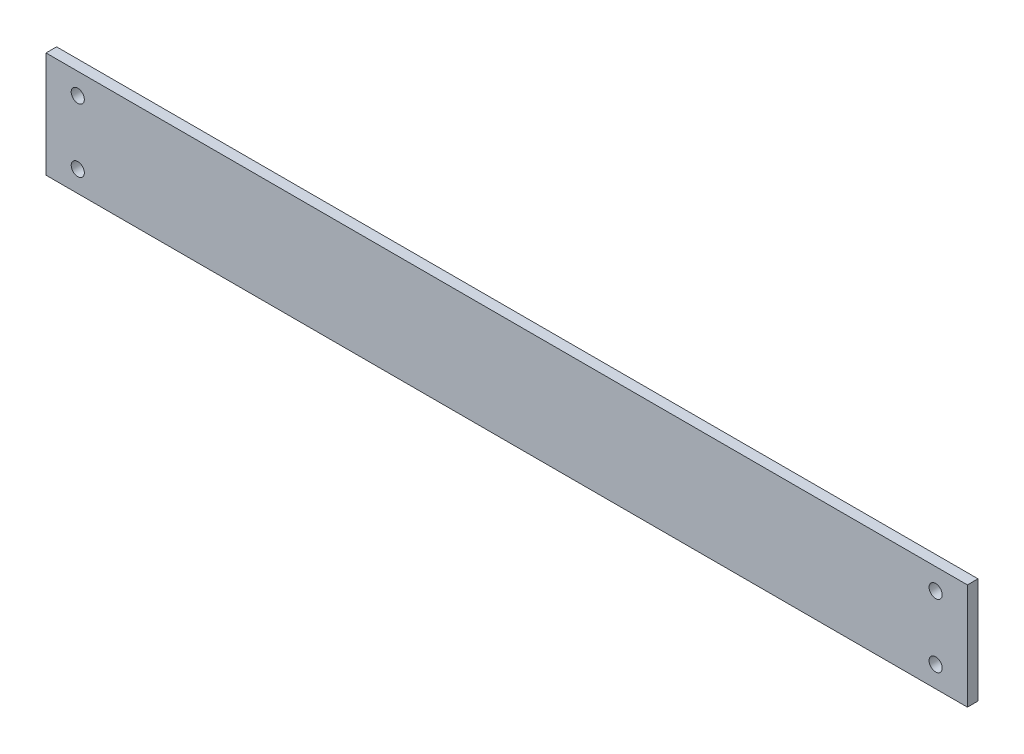
ISO-10303-21;
HEADER;
FILE_DESCRIPTION(('STEP AP214'),'2;1');
FILE_NAME('part.step','',(''),(''),'','','');
FILE_SCHEMA(('AUTOMOTIVE_DESIGN { 1 0 10303 214 1 1 1 1 }'));
ENDSEC;
DATA;
#1=APPLICATION_CONTEXT('core data for automotive mechanical design processes');
#2=APPLICATION_PROTOCOL_DEFINITION('international standard','automotive_design',2000,#1);
#3=PRODUCT_CONTEXT('',#1,'mechanical');
#4=PRODUCT('Part','Part','',(#3));
#5=PRODUCT_RELATED_PRODUCT_CATEGORY('part','',(#4));
#6=PRODUCT_DEFINITION_FORMATION('','',#4);
#7=PRODUCT_DEFINITION_CONTEXT('part definition',#1,'design');
#8=PRODUCT_DEFINITION('design','',#6,#7);
#9=PRODUCT_DEFINITION_SHAPE('','',#8);
#10=(LENGTH_UNIT() NAMED_UNIT(*) SI_UNIT(.MILLI.,.METRE.));
#11=(NAMED_UNIT(*) PLANE_ANGLE_UNIT() SI_UNIT($,.RADIAN.));
#12=(NAMED_UNIT(*) SI_UNIT($,.STERADIAN.) SOLID_ANGLE_UNIT());
#13=UNCERTAINTY_MEASURE_WITH_UNIT(LENGTH_MEASURE(1.E-05),#10,'distance_accuracy_value','');
#14=(GEOMETRIC_REPRESENTATION_CONTEXT(3) GLOBAL_UNCERTAINTY_ASSIGNED_CONTEXT((#13)) GLOBAL_UNIT_ASSIGNED_CONTEXT((#10,
#11,#12)) REPRESENTATION_CONTEXT('',''));
#15=CARTESIAN_POINT('',(0.,0.,0.));
#16=DIRECTION('',(0.,0.,1.));
#17=DIRECTION('',(1.,0.,0.));
#18=AXIS2_PLACEMENT_3D('',#15,#16,#17);
#19=CARTESIAN_POINT('',(257.175,19.0499999999999,-556.123704763608));
#20=DIRECTION('',(0.,0.,1.));
#21=DIRECTION('',(1.,0.,0.));
#22=AXIS2_PLACEMENT_3D('',#19,#20,#21);
#23=CYLINDRICAL_SURFACE('',#22,3.937);
#24=CARTESIAN_POINT('',(257.175,19.0499999999999,-6.34999999999998));
#25=DIRECTION('',(0.,0.,1.));
#26=DIRECTION('',(1.,0.,0.));
#27=AXIS2_PLACEMENT_3D('',#24,#25,#26);
#28=CIRCLE('',#27,3.937);
#29=CARTESIAN_POINT('',(261.112,19.0499999999999,-6.34999999999998));
#30=VERTEX_POINT('',#29);
#31=EDGE_CURVE('E81',#30,#30,#28,.T.);
#32=ORIENTED_EDGE('',*,*,#31,.F.);
#33=EDGE_LOOP('',(#32));
#34=FACE_BOUND('',#33,.T.);
#35=CARTESIAN_POINT('',(257.175,19.0499999999999,0.));
#36=DIRECTION('',(0.,0.,-1.));
#37=DIRECTION('',(0.,-1.,0.));
#38=AXIS2_PLACEMENT_3D('',#35,#36,#37);
#39=CIRCLE('',#38,3.937);
#40=CARTESIAN_POINT('',(257.175,15.1129999999999,0.));
#41=VERTEX_POINT('',#40);
#42=EDGE_CURVE('E94',#41,#41,#39,.T.);
#43=ORIENTED_EDGE('',*,*,#42,.F.);
#44=EDGE_LOOP('',(#43));
#45=FACE_BOUND('',#44,.T.);
#46=ADVANCED_FACE('F16',(#34,#45),#23,.F.);
#47=CARTESIAN_POINT('',(-257.175,19.0499999999999,-556.123704763608));
#48=DIRECTION('',(0.,0.,1.));
#49=DIRECTION('',(1.,0.,0.));
#50=AXIS2_PLACEMENT_3D('',#47,#48,#49);
#51=CYLINDRICAL_SURFACE('',#50,3.937);
#52=CARTESIAN_POINT('',(-257.175,19.0499999999999,-6.34999999999998));
#53=DIRECTION('',(0.,0.,1.));
#54=DIRECTION('',(1.,0.,0.));
#55=AXIS2_PLACEMENT_3D('',#52,#53,#54);
#56=CIRCLE('',#55,3.937);
#57=CARTESIAN_POINT('',(-253.238,19.0499999999999,-6.34999999999998));
#58=VERTEX_POINT('',#57);
#59=EDGE_CURVE('E108',#58,#58,#56,.T.);
#60=ORIENTED_EDGE('',*,*,#59,.F.);
#61=EDGE_LOOP('',(#60));
#62=FACE_BOUND('',#61,.T.);
#63=CARTESIAN_POINT('',(-257.175,19.0499999999999,0.));
#64=DIRECTION('',(0.,0.,-1.));
#65=DIRECTION('',(0.,-1.,0.));
#66=AXIS2_PLACEMENT_3D('',#63,#64,#65);
#67=CIRCLE('',#66,3.937);
#68=CARTESIAN_POINT('',(-257.175,15.1129999999999,0.));
#69=VERTEX_POINT('',#68);
#70=EDGE_CURVE('E105',#69,#69,#67,.T.);
#71=ORIENTED_EDGE('',*,*,#70,.F.);
#72=EDGE_LOOP('',(#71));
#73=FACE_BOUND('',#72,.T.);
#74=ADVANCED_FACE('F121',(#62,#73),#51,.F.);
#75=CARTESIAN_POINT('',(-257.175,-19.0500000000001,-556.123704763608));
#76=DIRECTION('',(0.,0.,1.));
#77=DIRECTION('',(1.,0.,0.));
#78=AXIS2_PLACEMENT_3D('',#75,#76,#77);
#79=CYLINDRICAL_SURFACE('',#78,3.937);
#80=CARTESIAN_POINT('',(-257.175,-19.0500000000001,-6.34999999999998));
#81=DIRECTION('',(0.,0.,1.));
#82=DIRECTION('',(1.,0.,0.));
#83=AXIS2_PLACEMENT_3D('',#80,#81,#82);
#84=CIRCLE('',#83,3.937);
#85=CARTESIAN_POINT('',(-253.238,-19.0500000000001,-6.34999999999998));
#86=VERTEX_POINT('',#85);
#87=EDGE_CURVE('E88',#86,#86,#84,.T.);
#88=ORIENTED_EDGE('',*,*,#87,.F.);
#89=EDGE_LOOP('',(#88));
#90=FACE_BOUND('',#89,.T.);
#91=CARTESIAN_POINT('',(-257.175,-19.0500000000001,0.));
#92=DIRECTION('',(0.,0.,-1.));
#93=DIRECTION('',(0.,-1.,0.));
#94=AXIS2_PLACEMENT_3D('',#91,#92,#93);
#95=CIRCLE('',#94,3.937);
#96=CARTESIAN_POINT('',(-257.175,-22.9870000000001,0.));
#97=VERTEX_POINT('',#96);
#98=EDGE_CURVE('E101',#97,#97,#95,.T.);
#99=ORIENTED_EDGE('',*,*,#98,.F.);
#100=EDGE_LOOP('',(#99));
#101=FACE_BOUND('',#100,.T.);
#102=ADVANCED_FACE('F18',(#90,#101),#79,.F.);
#103=CARTESIAN_POINT('',(257.175,-19.0500000000001,-556.123704763608));
#104=DIRECTION('',(0.,0.,1.));
#105=DIRECTION('',(1.,0.,0.));
#106=AXIS2_PLACEMENT_3D('',#103,#104,#105);
#107=CYLINDRICAL_SURFACE('',#106,3.937);
#108=CARTESIAN_POINT('',(257.175,-19.0500000000001,-6.34999999999998));
#109=DIRECTION('',(0.,0.,1.));
#110=DIRECTION('',(1.,0.,0.));
#111=AXIS2_PLACEMENT_3D('',#108,#109,#110);
#112=CIRCLE('',#111,3.937);
#113=CARTESIAN_POINT('',(261.112,-19.0500000000001,-6.34999999999998));
#114=VERTEX_POINT('',#113);
#115=EDGE_CURVE('E86',#114,#114,#112,.T.);
#116=ORIENTED_EDGE('',*,*,#115,.F.);
#117=EDGE_LOOP('',(#116));
#118=FACE_BOUND('',#117,.T.);
#119=CARTESIAN_POINT('',(257.175,-19.0500000000001,0.));
#120=DIRECTION('',(0.,0.,-1.));
#121=DIRECTION('',(0.,-1.,0.));
#122=AXIS2_PLACEMENT_3D('',#119,#120,#121);
#123=CIRCLE('',#122,3.937);
#124=CARTESIAN_POINT('',(257.175,-22.9870000000001,0.));
#125=VERTEX_POINT('',#124);
#126=EDGE_CURVE('E99',#125,#125,#123,.T.);
#127=ORIENTED_EDGE('',*,*,#126,.F.);
#128=EDGE_LOOP('',(#127));
#129=FACE_BOUND('',#128,.T.);
#130=ADVANCED_FACE('F133',(#118,#129),#107,.F.);
#131=CARTESIAN_POINT('',(276.225,31.75,0.));
#132=DIRECTION('',(1.,0.,0.));
#133=DIRECTION('',(0.,0.,-1.));
#134=AXIS2_PLACEMENT_3D('',#131,#132,#133);
#135=PLANE('',#134);
#136=DIRECTION('',(0.,1.,0.));
#137=VECTOR('',#136,1.);
#138=CARTESIAN_POINT('',(276.225,-31.75,0.));
#139=LINE('',#138,#137);
#140=CARTESIAN_POINT('',(276.225,-31.75,0.));
#141=VERTEX_POINT('',#140);
#142=CARTESIAN_POINT('',(276.225,31.75,0.));
#143=VERTEX_POINT('',#142);
#144=EDGE_CURVE('E34',#141,#143,#139,.T.);
#145=ORIENTED_EDGE('',*,*,#144,.F.);
#146=DIRECTION('',(0.,0.,-1.));
#147=VECTOR('',#146,1.);
#148=CARTESIAN_POINT('',(276.225,-31.75,0.));
#149=LINE('',#148,#147);
#150=CARTESIAN_POINT('',(276.225,-31.75,-6.35));
#151=VERTEX_POINT('',#150);
#152=EDGE_CURVE('E10',#141,#151,#149,.T.);
#153=ORIENTED_EDGE('',*,*,#152,.T.);
#154=DIRECTION('',(0.,-1.,0.));
#155=VECTOR('',#154,1.);
#156=CARTESIAN_POINT('',(276.225,31.75,-6.35));
#157=LINE('',#156,#155);
#158=CARTESIAN_POINT('',(276.225,31.75,-6.35));
#159=VERTEX_POINT('',#158);
#160=EDGE_CURVE('E79',#159,#151,#157,.T.);
#161=ORIENTED_EDGE('',*,*,#160,.F.);
#162=DIRECTION('',(0.,0.,-1.));
#163=VECTOR('',#162,1.);
#164=CARTESIAN_POINT('',(276.225,31.75,0.));
#165=LINE('',#164,#163);
#166=EDGE_CURVE('E26',#143,#159,#165,.T.);
#167=ORIENTED_EDGE('',*,*,#166,.F.);
#168=EDGE_LOOP('',(#145,#153,#161,#167));
#169=FACE_BOUND('',#168,.T.);
#170=ADVANCED_FACE('F83',(#169),#135,.T.);
#171=CARTESIAN_POINT('',(-276.225,31.7499999999999,0.));
#172=DIRECTION('',(0.,1.,0.));
#173=DIRECTION('',(0.,0.,1.));
#174=AXIS2_PLACEMENT_3D('',#171,#172,#173);
#175=PLANE('',#174);
#176=DIRECTION('',(-1.,0.,0.));
#177=VECTOR('',#176,1.);
#178=CARTESIAN_POINT('',(276.225,31.75,0.));
#179=LINE('',#178,#177);
#180=CARTESIAN_POINT('',(-276.225,31.7499999999999,0.));
#181=VERTEX_POINT('',#180);
#182=EDGE_CURVE('E90',#143,#181,#179,.T.);
#183=ORIENTED_EDGE('',*,*,#182,.F.);
#184=ORIENTED_EDGE('',*,*,#166,.T.);
#185=DIRECTION('',(1.,0.,0.));
#186=VECTOR('',#185,1.);
#187=CARTESIAN_POINT('',(-276.225,31.7499999999999,-6.35));
#188=LINE('',#187,#186);
#189=CARTESIAN_POINT('',(-276.225,31.7499999999999,-6.35));
#190=VERTEX_POINT('',#189);
#191=EDGE_CURVE('E70',#190,#159,#188,.T.);
#192=ORIENTED_EDGE('',*,*,#191,.F.);
#193=DIRECTION('',(0.,0.,-1.));
#194=VECTOR('',#193,1.);
#195=CARTESIAN_POINT('',(-276.225,31.7499999999999,0.));
#196=LINE('',#195,#194);
#197=EDGE_CURVE('E66',#181,#190,#196,.T.);
#198=ORIENTED_EDGE('',*,*,#197,.F.);
#199=EDGE_LOOP('',(#183,#184,#192,#198));
#200=FACE_BOUND('',#199,.T.);
#201=ADVANCED_FACE('F141',(#200),#175,.T.);
#202=CARTESIAN_POINT('',(-276.225,-31.75,0.));
#203=DIRECTION('',(-1.,0.,0.));
#204=DIRECTION('',(0.,0.,1.));
#205=AXIS2_PLACEMENT_3D('',#202,#203,#204);
#206=PLANE('',#205);
#207=DIRECTION('',(0.,-1.,0.));
#208=VECTOR('',#207,1.);
#209=CARTESIAN_POINT('',(-276.225,31.7499999999999,0.));
#210=LINE('',#209,#208);
#211=CARTESIAN_POINT('',(-276.225,-31.75,0.));
#212=VERTEX_POINT('',#211);
#213=EDGE_CURVE('E54',#181,#212,#210,.T.);
#214=ORIENTED_EDGE('',*,*,#213,.F.);
#215=ORIENTED_EDGE('',*,*,#197,.T.);
#216=DIRECTION('',(0.,1.,0.));
#217=VECTOR('',#216,1.);
#218=CARTESIAN_POINT('',(-276.225,-31.75,-6.35));
#219=LINE('',#218,#217);
#220=CARTESIAN_POINT('',(-276.225,-31.75,-6.35));
#221=VERTEX_POINT('',#220);
#222=EDGE_CURVE('E60',#221,#190,#219,.T.);
#223=ORIENTED_EDGE('',*,*,#222,.F.);
#224=DIRECTION('',(0.,0.,-1.));
#225=VECTOR('',#224,1.);
#226=CARTESIAN_POINT('',(-276.225,-31.75,0.));
#227=LINE('',#226,#225);
#228=EDGE_CURVE('E63',#212,#221,#227,.T.);
#229=ORIENTED_EDGE('',*,*,#228,.F.);
#230=EDGE_LOOP('',(#214,#215,#223,#229));
#231=FACE_BOUND('',#230,.T.);
#232=ADVANCED_FACE('F62',(#231),#206,.T.);
#233=CARTESIAN_POINT('',(276.225,-31.75,0.));
#234=DIRECTION('',(0.,-1.,0.));
#235=DIRECTION('',(0.,0.,-1.));
#236=AXIS2_PLACEMENT_3D('',#233,#234,#235);
#237=PLANE('',#236);
#238=DIRECTION('',(1.,0.,0.));
#239=VECTOR('',#238,1.);
#240=CARTESIAN_POINT('',(-276.225,-31.75,0.));
#241=LINE('',#240,#239);
#242=EDGE_CURVE('E75',#212,#141,#241,.T.);
#243=ORIENTED_EDGE('',*,*,#242,.F.);
#244=ORIENTED_EDGE('',*,*,#228,.T.);
#245=DIRECTION('',(-1.,0.,0.));
#246=VECTOR('',#245,1.);
#247=CARTESIAN_POINT('',(276.225,-31.75,-6.35));
#248=LINE('',#247,#246);
#249=EDGE_CURVE('E20',#151,#221,#248,.T.);
#250=ORIENTED_EDGE('',*,*,#249,.F.);
#251=ORIENTED_EDGE('',*,*,#152,.F.);
#252=EDGE_LOOP('',(#243,#244,#250,#251));
#253=FACE_BOUND('',#252,.T.);
#254=ADVANCED_FACE('F74',(#253),#237,.T.);
#255=CARTESIAN_POINT('',(1.609233002E-13,0.,-6.35));
#256=DIRECTION('',(0.,0.,1.));
#257=DIRECTION('',(1.,0.,0.));
#258=AXIS2_PLACEMENT_3D('',#255,#256,#257);
#259=PLANE('',#258);
#260=ORIENTED_EDGE('',*,*,#249,.T.);
#261=ORIENTED_EDGE('',*,*,#222,.T.);
#262=ORIENTED_EDGE('',*,*,#191,.T.);
#263=ORIENTED_EDGE('',*,*,#160,.T.);
#264=EDGE_LOOP('',(#260,#261,#262,#263));
#265=FACE_BOUND('',#264,.T.);
#266=ORIENTED_EDGE('',*,*,#31,.T.);
#267=EDGE_LOOP('',(#266));
#268=FACE_BOUND('',#267,.T.);
#269=ORIENTED_EDGE('',*,*,#59,.T.);
#270=EDGE_LOOP('',(#269));
#271=FACE_BOUND('',#270,.T.);
#272=ORIENTED_EDGE('',*,*,#87,.T.);
#273=EDGE_LOOP('',(#272));
#274=FACE_BOUND('',#273,.T.);
#275=ORIENTED_EDGE('',*,*,#115,.T.);
#276=EDGE_LOOP('',(#275));
#277=FACE_BOUND('',#276,.T.);
#278=ADVANCED_FACE('F77',(#265,#268,#271,#274,#277),#259,.F.);
#279=CARTESIAN_POINT('',(1.609233002E-13,0.,0.));
#280=DIRECTION('',(0.,0.,1.));
#281=DIRECTION('',(1.,0.,0.));
#282=AXIS2_PLACEMENT_3D('',#279,#280,#281);
#283=PLANE('',#282);
#284=ORIENTED_EDGE('',*,*,#242,.T.);
#285=ORIENTED_EDGE('',*,*,#144,.T.);
#286=ORIENTED_EDGE('',*,*,#182,.T.);
#287=ORIENTED_EDGE('',*,*,#213,.T.);
#288=EDGE_LOOP('',(#284,#285,#286,#287));
#289=FACE_BOUND('',#288,.T.);
#290=ORIENTED_EDGE('',*,*,#42,.T.);
#291=EDGE_LOOP('',(#290));
#292=FACE_BOUND('',#291,.T.);
#293=ORIENTED_EDGE('',*,*,#70,.T.);
#294=EDGE_LOOP('',(#293));
#295=FACE_BOUND('',#294,.T.);
#296=ORIENTED_EDGE('',*,*,#98,.T.);
#297=EDGE_LOOP('',(#296));
#298=FACE_BOUND('',#297,.T.);
#299=ORIENTED_EDGE('',*,*,#126,.T.);
#300=EDGE_LOOP('',(#299));
#301=FACE_BOUND('',#300,.T.);
#302=ADVANCED_FACE('F84',(#289,#292,#295,#298,#301),#283,.T.);
#303=CLOSED_SHELL('',(#46,#74,#102,#130,#170,#201,#232,#254,#278,#302));
#304=MANIFOLD_SOLID_BREP('B1',#303);
#305=ADVANCED_BREP_SHAPE_REPRESENTATION('',(#18,#304),#14);
#306=SHAPE_DEFINITION_REPRESENTATION(#9,#305);
ENDSEC;
END-ISO-10303-21;
